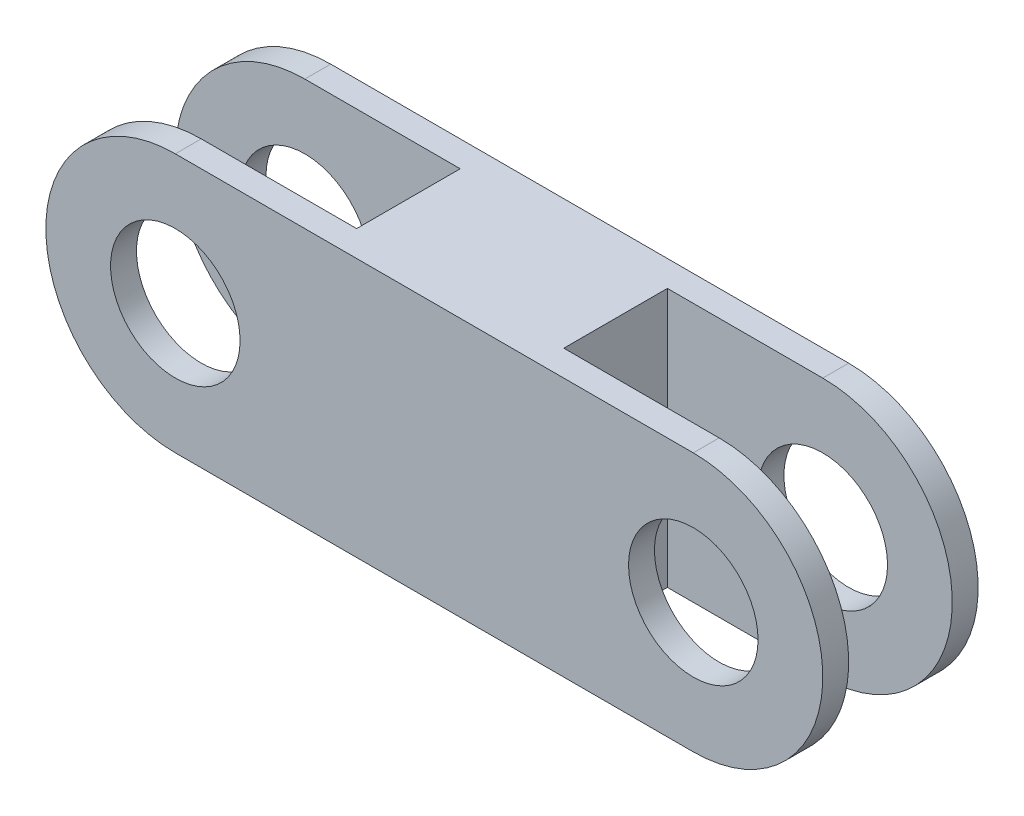
ISO-10303-21;
HEADER;
FILE_DESCRIPTION(('STEP AP214'),'2;1');
FILE_NAME('part.step','',(''),(''),'','','');
FILE_SCHEMA(('AUTOMOTIVE_DESIGN { 1 0 10303 214 1 1 1 1 }'));
ENDSEC;
DATA;
#1=APPLICATION_CONTEXT('core data for automotive mechanical design processes');
#2=APPLICATION_PROTOCOL_DEFINITION('international standard','automotive_design',2000,#1);
#3=PRODUCT_CONTEXT('',#1,'mechanical');
#4=PRODUCT('Part','Part','',(#3));
#5=PRODUCT_RELATED_PRODUCT_CATEGORY('part','',(#4));
#6=PRODUCT_DEFINITION_FORMATION('','',#4);
#7=PRODUCT_DEFINITION_CONTEXT('part definition',#1,'design');
#8=PRODUCT_DEFINITION('design','',#6,#7);
#9=PRODUCT_DEFINITION_SHAPE('','',#8);
#10=(LENGTH_UNIT() NAMED_UNIT(*) SI_UNIT(.MILLI.,.METRE.));
#11=(NAMED_UNIT(*) PLANE_ANGLE_UNIT() SI_UNIT($,.RADIAN.));
#12=(NAMED_UNIT(*) SI_UNIT($,.STERADIAN.) SOLID_ANGLE_UNIT());
#13=UNCERTAINTY_MEASURE_WITH_UNIT(LENGTH_MEASURE(1.E-05),#10,'distance_accuracy_value','');
#14=(GEOMETRIC_REPRESENTATION_CONTEXT(3) GLOBAL_UNCERTAINTY_ASSIGNED_CONTEXT((#13)) GLOBAL_UNIT_ASSIGNED_CONTEXT((#10,
#11,#12)) REPRESENTATION_CONTEXT('',''));
#15=CARTESIAN_POINT('',(0.,0.,0.));
#16=DIRECTION('',(0.,0.,1.));
#17=DIRECTION('',(1.,0.,0.));
#18=AXIS2_PLACEMENT_3D('',#15,#16,#17);
#19=CARTESIAN_POINT('',(0.,-5.,3.));
#20=DIRECTION('',(0.,1.,0.));
#21=DIRECTION('',(0.,0.,1.));
#22=AXIS2_PLACEMENT_3D('',#19,#20,#21);
#23=PLANE('',#22);
#24=DIRECTION('',(-1.,0.,0.));
#25=VECTOR('',#24,1.);
#26=CARTESIAN_POINT('',(34.,-5.,2.));
#27=LINE('',#26,#25);
#28=CARTESIAN_POINT('',(20.,-5.,2.));
#29=VERTEX_POINT('',#28);
#30=CARTESIAN_POINT('',(14.,-5.,2.));
#31=VERTEX_POINT('',#30);
#32=EDGE_CURVE('E138',#29,#31,#27,.T.);
#33=ORIENTED_EDGE('',*,*,#32,.F.);
#34=DIRECTION('',(0.,0.,-1.));
#35=VECTOR('',#34,1.);
#36=CARTESIAN_POINT('',(20.,-5.,3.));
#37=LINE('',#36,#35);
#38=CARTESIAN_POINT('',(20.,-5.,3.));
#39=VERTEX_POINT('',#38);
#40=EDGE_CURVE('E229',#39,#29,#37,.T.);
#41=ORIENTED_EDGE('',*,*,#40,.F.);
#42=DIRECTION('',(1.,0.,0.));
#43=VECTOR('',#42,1.);
#44=CARTESIAN_POINT('',(0.,-5.,3.));
#45=LINE('',#44,#43);
#46=CARTESIAN_POINT('',(0.,-5.,3.));
#47=VERTEX_POINT('',#46);
#48=EDGE_CURVE('E205',#47,#39,#45,.T.);
#49=ORIENTED_EDGE('',*,*,#48,.F.);
#50=DIRECTION('',(0.,0.,-1.));
#51=VECTOR('',#50,1.);
#52=CARTESIAN_POINT('',(0.,-5.,3.));
#53=LINE('',#52,#51);
#54=CARTESIAN_POINT('',(0.,-5.,2.));
#55=VERTEX_POINT('',#54);
#56=EDGE_CURVE('E11',#47,#55,#53,.T.);
#57=ORIENTED_EDGE('',*,*,#56,.T.);
#58=DIRECTION('',(1.,0.,0.));
#59=VECTOR('',#58,1.);
#60=CARTESIAN_POINT('',(-14.,-5.,2.));
#61=LINE('',#60,#59);
#62=CARTESIAN_POINT('',(6.,-5.,2.));
#63=VERTEX_POINT('',#62);
#64=EDGE_CURVE('E163',#55,#63,#61,.T.);
#65=ORIENTED_EDGE('',*,*,#64,.T.);
#66=DIRECTION('',(0.,0.,-1.));
#67=VECTOR('',#66,1.);
#68=CARTESIAN_POINT('',(6.,-5.,-2.));
#69=LINE('',#68,#67);
#70=CARTESIAN_POINT('',(6.,-5.,-2.));
#71=VERTEX_POINT('',#70);
#72=EDGE_CURVE('E166',#63,#71,#69,.T.);
#73=ORIENTED_EDGE('',*,*,#72,.T.);
#74=DIRECTION('',(-1.,0.,0.));
#75=VECTOR('',#74,1.);
#76=CARTESIAN_POINT('',(-14.,-5.,-2.));
#77=LINE('',#76,#75);
#78=CARTESIAN_POINT('',(0.,-5.,-2.));
#79=VERTEX_POINT('',#78);
#80=EDGE_CURVE('E170',#71,#79,#77,.T.);
#81=ORIENTED_EDGE('',*,*,#80,.T.);
#82=CARTESIAN_POINT('',(0.,-5.,-3.));
#83=VERTEX_POINT('',#82);
#84=EDGE_CURVE('E46',#79,#83,#53,.T.);
#85=ORIENTED_EDGE('',*,*,#84,.T.);
#86=DIRECTION('',(1.,0.,0.));
#87=VECTOR('',#86,1.);
#88=CARTESIAN_POINT('',(0.,-5.,-3.));
#89=LINE('',#88,#87);
#90=CARTESIAN_POINT('',(20.,-5.,-3.));
#91=VERTEX_POINT('',#90);
#92=EDGE_CURVE('E215',#83,#91,#89,.T.);
#93=ORIENTED_EDGE('',*,*,#92,.T.);
#94=CARTESIAN_POINT('',(20.,-5.,-2.));
#95=VERTEX_POINT('',#94);
#96=EDGE_CURVE('E147',#95,#91,#37,.T.);
#97=ORIENTED_EDGE('',*,*,#96,.F.);
#98=DIRECTION('',(1.,0.,0.));
#99=VECTOR('',#98,1.);
#100=CARTESIAN_POINT('',(34.,-5.,-2.));
#101=LINE('',#100,#99);
#102=CARTESIAN_POINT('',(14.,-5.,-2.));
#103=VERTEX_POINT('',#102);
#104=EDGE_CURVE('E139',#103,#95,#101,.T.);
#105=ORIENTED_EDGE('',*,*,#104,.F.);
#106=DIRECTION('',(0.,0.,-1.));
#107=VECTOR('',#106,1.);
#108=CARTESIAN_POINT('',(14.,-5.,-2.));
#109=LINE('',#108,#107);
#110=EDGE_CURVE('E129',#31,#103,#109,.T.);
#111=ORIENTED_EDGE('',*,*,#110,.F.);
#112=EDGE_LOOP('',(#33,#41,#49,#57,#65,#73,#81,#85,#93,#97,#105,#111));
#113=FACE_BOUND('',#112,.T.);
#114=ADVANCED_FACE('F37',(#113),#23,.F.);
#115=CARTESIAN_POINT('',(20.,0.,3.));
#116=DIRECTION('',(0.,0.,-1.));
#117=DIRECTION('',(-1.,0.,0.));
#118=AXIS2_PLACEMENT_3D('',#115,#116,#117);
#119=CYLINDRICAL_SURFACE('',#118,5.);
#120=CARTESIAN_POINT('',(20.,0.,2.));
#121=DIRECTION('',(0.,0.,-1.));
#122=DIRECTION('',(-1.,0.,0.));
#123=AXIS2_PLACEMENT_3D('',#120,#121,#122);
#124=CIRCLE('',#123,5.);
#125=CARTESIAN_POINT('',(20.,5.,2.));
#126=VERTEX_POINT('',#125);
#127=EDGE_CURVE('E160',#126,#29,#124,.T.);
#128=ORIENTED_EDGE('',*,*,#127,.F.);
#129=DIRECTION('',(0.,0.,-1.));
#130=VECTOR('',#129,1.);
#131=CARTESIAN_POINT('',(20.,5.,3.));
#132=LINE('',#131,#130);
#133=CARTESIAN_POINT('',(20.,5.,3.));
#134=VERTEX_POINT('',#133);
#135=EDGE_CURVE('E226',#134,#126,#132,.T.);
#136=ORIENTED_EDGE('',*,*,#135,.F.);
#137=CARTESIAN_POINT('',(20.,0.,3.));
#138=DIRECTION('',(0.,0.,1.));
#139=DIRECTION('',(1.,0.,0.));
#140=AXIS2_PLACEMENT_3D('',#137,#138,#139);
#141=CIRCLE('',#140,5.);
#142=EDGE_CURVE('E208',#39,#134,#141,.T.);
#143=ORIENTED_EDGE('',*,*,#142,.F.);
#144=ORIENTED_EDGE('',*,*,#40,.T.);
#145=EDGE_LOOP('',(#128,#136,#143,#144));
#146=FACE_BOUND('',#145,.T.);
#147=ADVANCED_FACE('F253',(#146),#119,.T.);
#148=CARTESIAN_POINT('',(20.,0.,-2.));
#149=DIRECTION('',(0.,0.,1.));
#150=DIRECTION('',(1.,0.,0.));
#151=AXIS2_PLACEMENT_3D('',#148,#149,#150);
#152=CIRCLE('',#151,5.);
#153=CARTESIAN_POINT('',(20.,5.,-2.));
#154=VERTEX_POINT('',#153);
#155=EDGE_CURVE('E54',#95,#154,#152,.T.);
#156=ORIENTED_EDGE('',*,*,#155,.F.);
#157=ORIENTED_EDGE('',*,*,#96,.T.);
#158=CARTESIAN_POINT('',(20.,0.,-3.));
#159=DIRECTION('',(0.,0.,1.));
#160=DIRECTION('',(1.,0.,0.));
#161=AXIS2_PLACEMENT_3D('',#158,#159,#160);
#162=CIRCLE('',#161,5.);
#163=CARTESIAN_POINT('',(20.,5.,-3.));
#164=VERTEX_POINT('',#163);
#165=EDGE_CURVE('E217',#91,#164,#162,.T.);
#166=ORIENTED_EDGE('',*,*,#165,.T.);
#167=EDGE_CURVE('E225',#154,#164,#132,.T.);
#168=ORIENTED_EDGE('',*,*,#167,.F.);
#169=EDGE_LOOP('',(#156,#157,#166,#168));
#170=FACE_BOUND('',#169,.T.);
#171=ADVANCED_FACE('F257',(#170),#119,.T.);
#172=CARTESIAN_POINT('',(0.,5.,3.));
#173=DIRECTION('',(0.,-1.,0.));
#174=DIRECTION('',(0.,0.,-1.));
#175=AXIS2_PLACEMENT_3D('',#172,#173,#174);
#176=PLANE('',#175);
#177=DIRECTION('',(-1.,0.,0.));
#178=VECTOR('',#177,1.);
#179=CARTESIAN_POINT('',(34.,5.,2.));
#180=LINE('',#179,#178);
#181=CARTESIAN_POINT('',(14.,5.,2.));
#182=VERTEX_POINT('',#181);
#183=EDGE_CURVE('E148',#126,#182,#180,.T.);
#184=ORIENTED_EDGE('',*,*,#183,.T.);
#185=DIRECTION('',(0.,0.,-1.));
#186=VECTOR('',#185,1.);
#187=CARTESIAN_POINT('',(14.,5.,-2.));
#188=LINE('',#187,#186);
#189=CARTESIAN_POINT('',(14.,5.,-2.));
#190=VERTEX_POINT('',#189);
#191=EDGE_CURVE('E151',#182,#190,#188,.T.);
#192=ORIENTED_EDGE('',*,*,#191,.T.);
#193=DIRECTION('',(1.,0.,0.));
#194=VECTOR('',#193,1.);
#195=CARTESIAN_POINT('',(34.,5.,-2.));
#196=LINE('',#195,#194);
#197=EDGE_CURVE('E142',#190,#154,#196,.T.);
#198=ORIENTED_EDGE('',*,*,#197,.T.);
#199=ORIENTED_EDGE('',*,*,#167,.T.);
#200=DIRECTION('',(-1.,0.,0.));
#201=VECTOR('',#200,1.);
#202=CARTESIAN_POINT('',(0.,5.,-3.));
#203=LINE('',#202,#201);
#204=CARTESIAN_POINT('',(0.,5.,-3.));
#205=VERTEX_POINT('',#204);
#206=EDGE_CURVE('E206',#164,#205,#203,.T.);
#207=ORIENTED_EDGE('',*,*,#206,.T.);
#208=DIRECTION('',(0.,0.,-1.));
#209=VECTOR('',#208,1.);
#210=CARTESIAN_POINT('',(0.,5.,3.));
#211=LINE('',#210,#209);
#212=CARTESIAN_POINT('',(0.,5.,-2.));
#213=VERTEX_POINT('',#212);
#214=EDGE_CURVE('E212',#213,#205,#211,.T.);
#215=ORIENTED_EDGE('',*,*,#214,.F.);
#216=DIRECTION('',(-1.,0.,0.));
#217=VECTOR('',#216,1.);
#218=CARTESIAN_POINT('',(-14.,5.,-2.));
#219=LINE('',#218,#217);
#220=CARTESIAN_POINT('',(6.,5.,-2.));
#221=VERTEX_POINT('',#220);
#222=EDGE_CURVE('E167',#221,#213,#219,.T.);
#223=ORIENTED_EDGE('',*,*,#222,.F.);
#224=DIRECTION('',(0.,0.,-1.));
#225=VECTOR('',#224,1.);
#226=CARTESIAN_POINT('',(6.,5.,-2.));
#227=LINE('',#226,#225);
#228=CARTESIAN_POINT('',(6.,5.,2.));
#229=VERTEX_POINT('',#228);
#230=EDGE_CURVE('E175',#229,#221,#227,.T.);
#231=ORIENTED_EDGE('',*,*,#230,.F.);
#232=DIRECTION('',(1.,0.,0.));
#233=VECTOR('',#232,1.);
#234=CARTESIAN_POINT('',(-14.,5.,2.));
#235=LINE('',#234,#233);
#236=CARTESIAN_POINT('',(0.,5.,2.));
#237=VERTEX_POINT('',#236);
#238=EDGE_CURVE('E162',#237,#229,#235,.T.);
#239=ORIENTED_EDGE('',*,*,#238,.F.);
#240=CARTESIAN_POINT('',(0.,5.,3.));
#241=VERTEX_POINT('',#240);
#242=EDGE_CURVE('E222',#241,#237,#211,.T.);
#243=ORIENTED_EDGE('',*,*,#242,.F.);
#244=DIRECTION('',(-1.,0.,0.));
#245=VECTOR('',#244,1.);
#246=CARTESIAN_POINT('',(0.,5.,3.));
#247=LINE('',#246,#245);
#248=EDGE_CURVE('E210',#134,#241,#247,.T.);
#249=ORIENTED_EDGE('',*,*,#248,.F.);
#250=ORIENTED_EDGE('',*,*,#135,.T.);
#251=EDGE_LOOP('',(#184,#192,#198,#199,#207,#215,#223,#231,#239,#243,#249,#250));
#252=FACE_BOUND('',#251,.T.);
#253=ADVANCED_FACE('F261',(#252),#176,.F.);
#254=CARTESIAN_POINT('',(20.,0.,3.));
#255=DIRECTION('',(0.,0.,-1.));
#256=DIRECTION('',(-1.,0.,0.));
#257=AXIS2_PLACEMENT_3D('',#254,#255,#256);
#258=CYLINDRICAL_SURFACE('',#257,2.5);
#259=CARTESIAN_POINT('',(20.,0.,3.));
#260=DIRECTION('',(0.,0.,1.));
#261=DIRECTION('',(1.,0.,0.));
#262=AXIS2_PLACEMENT_3D('',#259,#260,#261);
#263=CIRCLE('',#262,2.5);
#264=CARTESIAN_POINT('',(22.5,0.,3.));
#265=VERTEX_POINT('',#264);
#266=EDGE_CURVE('E190',#265,#265,#263,.T.);
#267=ORIENTED_EDGE('',*,*,#266,.T.);
#268=EDGE_LOOP('',(#267));
#269=FACE_BOUND('',#268,.T.);
#270=CARTESIAN_POINT('',(20.,0.,2.));
#271=DIRECTION('',(0.,0.,-1.));
#272=DIRECTION('',(-1.,0.,0.));
#273=AXIS2_PLACEMENT_3D('',#270,#271,#272);
#274=CIRCLE('',#273,2.5);
#275=CARTESIAN_POINT('',(17.5,0.,2.));
#276=VERTEX_POINT('',#275);
#277=EDGE_CURVE('E41',#276,#276,#274,.T.);
#278=ORIENTED_EDGE('',*,*,#277,.T.);
#279=EDGE_LOOP('',(#278));
#280=FACE_BOUND('',#279,.T.);
#281=ADVANCED_FACE('F264',(#269,#280),#258,.F.);
#282=CARTESIAN_POINT('',(20.,0.,-3.));
#283=DIRECTION('',(0.,0.,1.));
#284=DIRECTION('',(1.,0.,0.));
#285=AXIS2_PLACEMENT_3D('',#282,#283,#284);
#286=CIRCLE('',#285,2.5);
#287=CARTESIAN_POINT('',(22.5,0.,-3.));
#288=VERTEX_POINT('',#287);
#289=EDGE_CURVE('E189',#288,#288,#286,.T.);
#290=ORIENTED_EDGE('',*,*,#289,.F.);
#291=EDGE_LOOP('',(#290));
#292=FACE_BOUND('',#291,.T.);
#293=CARTESIAN_POINT('',(20.,0.,-2.));
#294=DIRECTION('',(0.,0.,1.));
#295=DIRECTION('',(1.,0.,0.));
#296=AXIS2_PLACEMENT_3D('',#293,#294,#295);
#297=CIRCLE('',#296,2.5);
#298=CARTESIAN_POINT('',(22.5,0.,-2.));
#299=VERTEX_POINT('',#298);
#300=EDGE_CURVE('E157',#299,#299,#297,.T.);
#301=ORIENTED_EDGE('',*,*,#300,.T.);
#302=EDGE_LOOP('',(#301));
#303=FACE_BOUND('',#302,.T.);
#304=ADVANCED_FACE('F238',(#292,#303),#258,.F.);
#305=CARTESIAN_POINT('',(0.,0.,3.));
#306=DIRECTION('',(0.,0.,-1.));
#307=DIRECTION('',(-1.,0.,0.));
#308=AXIS2_PLACEMENT_3D('',#305,#306,#307);
#309=CYLINDRICAL_SURFACE('',#308,5.);
#310=ORIENTED_EDGE('',*,*,#84,.F.);
#311=CARTESIAN_POINT('',(0.,0.,-2.));
#312=DIRECTION('',(0.,0.,-1.));
#313=DIRECTION('',(-1.,0.,0.));
#314=AXIS2_PLACEMENT_3D('',#311,#312,#313);
#315=CIRCLE('',#314,5.);
#316=EDGE_CURVE('E186',#79,#213,#315,.T.);
#317=ORIENTED_EDGE('',*,*,#316,.T.);
#318=ORIENTED_EDGE('',*,*,#214,.T.);
#319=CARTESIAN_POINT('',(0.,0.,-3.));
#320=DIRECTION('',(0.,0.,1.));
#321=DIRECTION('',(1.,0.,0.));
#322=AXIS2_PLACEMENT_3D('',#319,#320,#321);
#323=CIRCLE('',#322,5.);
#324=EDGE_CURVE('E199',#205,#83,#323,.T.);
#325=ORIENTED_EDGE('',*,*,#324,.T.);
#326=EDGE_LOOP('',(#310,#317,#318,#325));
#327=FACE_BOUND('',#326,.T.);
#328=ADVANCED_FACE('F302',(#327),#309,.T.);
#329=CARTESIAN_POINT('',(0.,0.,3.));
#330=DIRECTION('',(0.,0.,-1.));
#331=DIRECTION('',(-1.,0.,0.));
#332=AXIS2_PLACEMENT_3D('',#329,#330,#331);
#333=CYLINDRICAL_SURFACE('',#332,2.5);
#334=CARTESIAN_POINT('',(0.,0.,-2.));
#335=DIRECTION('',(0.,0.,-1.));
#336=DIRECTION('',(-1.,0.,0.));
#337=AXIS2_PLACEMENT_3D('',#334,#335,#336);
#338=CIRCLE('',#337,2.5);
#339=CARTESIAN_POINT('',(-2.5,0.,-2.));
#340=VERTEX_POINT('',#339);
#341=EDGE_CURVE('E185',#340,#340,#338,.T.);
#342=ORIENTED_EDGE('',*,*,#341,.F.);
#343=EDGE_LOOP('',(#342));
#344=FACE_BOUND('',#343,.T.);
#345=CARTESIAN_POINT('',(0.,0.,-3.));
#346=DIRECTION('',(0.,0.,1.));
#347=DIRECTION('',(1.,0.,0.));
#348=AXIS2_PLACEMENT_3D('',#345,#346,#347);
#349=CIRCLE('',#348,2.5);
#350=CARTESIAN_POINT('',(2.5,0.,-3.));
#351=VERTEX_POINT('',#350);
#352=EDGE_CURVE('E193',#351,#351,#349,.T.);
#353=ORIENTED_EDGE('',*,*,#352,.F.);
#354=EDGE_LOOP('',(#353));
#355=FACE_BOUND('',#354,.T.);
#356=ADVANCED_FACE('F273',(#344,#355),#333,.F.);
#357=CARTESIAN_POINT('',(0.,0.,3.));
#358=DIRECTION('',(0.,0.,1.));
#359=DIRECTION('',(1.,0.,0.));
#360=AXIS2_PLACEMENT_3D('',#357,#358,#359);
#361=PLANE('',#360);
#362=CARTESIAN_POINT('',(0.,0.,3.));
#363=DIRECTION('',(0.,0.,1.));
#364=DIRECTION('',(1.,0.,0.));
#365=AXIS2_PLACEMENT_3D('',#362,#363,#364);
#366=CIRCLE('',#365,2.5);
#367=CARTESIAN_POINT('',(2.5,0.,3.));
#368=VERTEX_POINT('',#367);
#369=EDGE_CURVE('E196',#368,#368,#366,.T.);
#370=ORIENTED_EDGE('',*,*,#369,.F.);
#371=EDGE_LOOP('',(#370));
#372=FACE_BOUND('',#371,.T.);
#373=CARTESIAN_POINT('',(0.,0.,3.));
#374=DIRECTION('',(0.,0.,1.));
#375=DIRECTION('',(1.,0.,0.));
#376=AXIS2_PLACEMENT_3D('',#373,#374,#375);
#377=CIRCLE('',#376,5.);
#378=EDGE_CURVE('E202',#241,#47,#377,.T.);
#379=ORIENTED_EDGE('',*,*,#378,.T.);
#380=ORIENTED_EDGE('',*,*,#48,.T.);
#381=ORIENTED_EDGE('',*,*,#142,.T.);
#382=ORIENTED_EDGE('',*,*,#248,.T.);
#383=EDGE_LOOP('',(#379,#380,#381,#382));
#384=FACE_BOUND('',#383,.T.);
#385=ORIENTED_EDGE('',*,*,#266,.F.);
#386=EDGE_LOOP('',(#385));
#387=FACE_BOUND('',#386,.T.);
#388=ADVANCED_FACE('F269',(#372,#384,#387),#361,.T.);
#389=CARTESIAN_POINT('',(0.,0.,-3.));
#390=DIRECTION('',(0.,0.,1.));
#391=DIRECTION('',(1.,0.,0.));
#392=AXIS2_PLACEMENT_3D('',#389,#390,#391);
#393=PLANE('',#392);
#394=ORIENTED_EDGE('',*,*,#324,.F.);
#395=ORIENTED_EDGE('',*,*,#206,.F.);
#396=ORIENTED_EDGE('',*,*,#165,.F.);
#397=ORIENTED_EDGE('',*,*,#92,.F.);
#398=EDGE_LOOP('',(#394,#395,#396,#397));
#399=FACE_BOUND('',#398,.T.);
#400=ORIENTED_EDGE('',*,*,#352,.T.);
#401=EDGE_LOOP('',(#400));
#402=FACE_BOUND('',#401,.T.);
#403=ORIENTED_EDGE('',*,*,#289,.T.);
#404=EDGE_LOOP('',(#403));
#405=FACE_BOUND('',#404,.T.);
#406=ADVANCED_FACE('F266',(#399,#402,#405),#393,.F.);
#407=ORIENTED_EDGE('',*,*,#242,.T.);
#408=CARTESIAN_POINT('',(0.,0.,2.));
#409=DIRECTION('',(0.,0.,1.));
#410=DIRECTION('',(1.,0.,0.));
#411=AXIS2_PLACEMENT_3D('',#408,#409,#410);
#412=CIRCLE('',#411,5.);
#413=EDGE_CURVE('E62',#237,#55,#412,.T.);
#414=ORIENTED_EDGE('',*,*,#413,.T.);
#415=ORIENTED_EDGE('',*,*,#56,.F.);
#416=ORIENTED_EDGE('',*,*,#378,.F.);
#417=EDGE_LOOP('',(#407,#414,#415,#416));
#418=FACE_BOUND('',#417,.T.);
#419=ADVANCED_FACE('F39',(#418),#309,.T.);
#420=CARTESIAN_POINT('',(0.,0.,2.));
#421=DIRECTION('',(0.,0.,1.));
#422=DIRECTION('',(1.,0.,0.));
#423=AXIS2_PLACEMENT_3D('',#420,#421,#422);
#424=CIRCLE('',#423,2.5);
#425=CARTESIAN_POINT('',(2.5,0.,2.));
#426=VERTEX_POINT('',#425);
#427=EDGE_CURVE('E181',#426,#426,#424,.T.);
#428=ORIENTED_EDGE('',*,*,#427,.F.);
#429=EDGE_LOOP('',(#428));
#430=FACE_BOUND('',#429,.T.);
#431=ORIENTED_EDGE('',*,*,#369,.T.);
#432=EDGE_LOOP('',(#431));
#433=FACE_BOUND('',#432,.T.);
#434=ADVANCED_FACE('F275',(#430,#433),#333,.F.);
#435=CARTESIAN_POINT('',(-14.,-5.,-2.));
#436=DIRECTION('',(0.,0.,-1.));
#437=DIRECTION('',(-1.,0.,0.));
#438=AXIS2_PLACEMENT_3D('',#435,#436,#437);
#439=PLANE('',#438);
#440=ORIENTED_EDGE('',*,*,#341,.T.);
#441=EDGE_LOOP('',(#440));
#442=FACE_BOUND('',#441,.T.);
#443=ORIENTED_EDGE('',*,*,#80,.F.);
#444=DIRECTION('',(0.,1.,0.));
#445=VECTOR('',#444,1.);
#446=CARTESIAN_POINT('',(6.,-5.,-2.));
#447=LINE('',#446,#445);
#448=EDGE_CURVE('E179',#71,#221,#447,.T.);
#449=ORIENTED_EDGE('',*,*,#448,.T.);
#450=ORIENTED_EDGE('',*,*,#222,.T.);
#451=ORIENTED_EDGE('',*,*,#316,.F.);
#452=EDGE_LOOP('',(#443,#449,#450,#451));
#453=FACE_BOUND('',#452,.T.);
#454=ADVANCED_FACE('F278',(#442,#453),#439,.F.);
#455=CARTESIAN_POINT('',(-14.,-5.,2.));
#456=DIRECTION('',(0.,0.,1.));
#457=DIRECTION('',(1.,0.,0.));
#458=AXIS2_PLACEMENT_3D('',#455,#456,#457);
#459=PLANE('',#458);
#460=ORIENTED_EDGE('',*,*,#427,.T.);
#461=EDGE_LOOP('',(#460));
#462=FACE_BOUND('',#461,.T.);
#463=ORIENTED_EDGE('',*,*,#238,.T.);
#464=DIRECTION('',(0.,1.,0.));
#465=VECTOR('',#464,1.);
#466=CARTESIAN_POINT('',(6.,-5.,2.));
#467=LINE('',#466,#465);
#468=EDGE_CURVE('E173',#63,#229,#467,.T.);
#469=ORIENTED_EDGE('',*,*,#468,.F.);
#470=ORIENTED_EDGE('',*,*,#64,.F.);
#471=ORIENTED_EDGE('',*,*,#413,.F.);
#472=EDGE_LOOP('',(#463,#469,#470,#471));
#473=FACE_BOUND('',#472,.T.);
#474=ADVANCED_FACE('F283',(#462,#473),#459,.F.);
#475=CARTESIAN_POINT('',(6.,-5.,-2.));
#476=DIRECTION('',(1.,0.,0.));
#477=DIRECTION('',(0.,0.,-1.));
#478=AXIS2_PLACEMENT_3D('',#475,#476,#477);
#479=PLANE('',#478);
#480=ORIENTED_EDGE('',*,*,#230,.T.);
#481=ORIENTED_EDGE('',*,*,#448,.F.);
#482=ORIENTED_EDGE('',*,*,#72,.F.);
#483=ORIENTED_EDGE('',*,*,#468,.T.);
#484=EDGE_LOOP('',(#480,#481,#482,#483));
#485=FACE_BOUND('',#484,.T.);
#486=ADVANCED_FACE('F248',(#485),#479,.F.);
#487=CARTESIAN_POINT('',(34.,-5.,2.));
#488=DIRECTION('',(0.,0.,-1.));
#489=DIRECTION('',(-1.,0.,0.));
#490=AXIS2_PLACEMENT_3D('',#487,#488,#489);
#491=PLANE('',#490);
#492=ORIENTED_EDGE('',*,*,#277,.F.);
#493=EDGE_LOOP('',(#492));
#494=FACE_BOUND('',#493,.T.);
#495=ORIENTED_EDGE('',*,*,#127,.T.);
#496=ORIENTED_EDGE('',*,*,#32,.T.);
#497=DIRECTION('',(0.,1.,0.));
#498=VECTOR('',#497,1.);
#499=CARTESIAN_POINT('',(14.,-5.,2.));
#500=LINE('',#499,#498);
#501=EDGE_CURVE('E134',#31,#182,#500,.T.);
#502=ORIENTED_EDGE('',*,*,#501,.T.);
#503=ORIENTED_EDGE('',*,*,#183,.F.);
#504=EDGE_LOOP('',(#495,#496,#502,#503));
#505=FACE_BOUND('',#504,.T.);
#506=ADVANCED_FACE('F241',(#494,#505),#491,.T.);
#507=CARTESIAN_POINT('',(34.,-5.,-2.));
#508=DIRECTION('',(0.,0.,1.));
#509=DIRECTION('',(1.,0.,0.));
#510=AXIS2_PLACEMENT_3D('',#507,#508,#509);
#511=PLANE('',#510);
#512=ORIENTED_EDGE('',*,*,#300,.F.);
#513=EDGE_LOOP('',(#512));
#514=FACE_BOUND('',#513,.T.);
#515=ORIENTED_EDGE('',*,*,#155,.T.);
#516=ORIENTED_EDGE('',*,*,#197,.F.);
#517=DIRECTION('',(0.,1.,0.));
#518=VECTOR('',#517,1.);
#519=CARTESIAN_POINT('',(14.,-5.,-2.));
#520=LINE('',#519,#518);
#521=EDGE_CURVE('E133',#103,#190,#520,.T.);
#522=ORIENTED_EDGE('',*,*,#521,.F.);
#523=ORIENTED_EDGE('',*,*,#104,.T.);
#524=EDGE_LOOP('',(#515,#516,#522,#523));
#525=FACE_BOUND('',#524,.T.);
#526=ADVANCED_FACE('F141',(#514,#525),#511,.T.);
#527=CARTESIAN_POINT('',(14.,-5.,-2.));
#528=DIRECTION('',(1.,0.,0.));
#529=DIRECTION('',(0.,0.,-1.));
#530=AXIS2_PLACEMENT_3D('',#527,#528,#529);
#531=PLANE('',#530);
#532=ORIENTED_EDGE('',*,*,#191,.F.);
#533=ORIENTED_EDGE('',*,*,#501,.F.);
#534=ORIENTED_EDGE('',*,*,#110,.T.);
#535=ORIENTED_EDGE('',*,*,#521,.T.);
#536=EDGE_LOOP('',(#532,#533,#534,#535));
#537=FACE_BOUND('',#536,.T.);
#538=ADVANCED_FACE('F132',(#537),#531,.T.);
#539=CLOSED_SHELL('',(#114,#147,#171,#253,#281,#304,#328,#356,#388,#406,#419,#434,#454,#474,
#486,#506,#526,#538));
#540=MANIFOLD_SOLID_BREP('B2',#539);
#541=ADVANCED_BREP_SHAPE_REPRESENTATION('',(#18,#540),#14);
#542=SHAPE_DEFINITION_REPRESENTATION(#9,#541);
ENDSEC;
END-ISO-10303-21;
